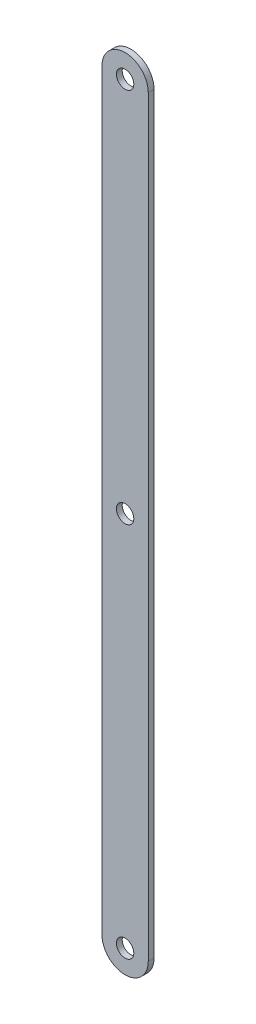
ISO-10303-21;
HEADER;
FILE_DESCRIPTION(('STEP AP214'),'2;1');
FILE_NAME('part.step','',(''),(''),'','','');
FILE_SCHEMA(('AUTOMOTIVE_DESIGN { 1 0 10303 214 1 1 1 1 }'));
ENDSEC;
DATA;
#1=APPLICATION_CONTEXT('core data for automotive mechanical design processes');
#2=APPLICATION_PROTOCOL_DEFINITION('international standard','automotive_design',2000,#1);
#3=PRODUCT_CONTEXT('',#1,'mechanical');
#4=PRODUCT('Part','Part','',(#3));
#5=PRODUCT_RELATED_PRODUCT_CATEGORY('part','',(#4));
#6=PRODUCT_DEFINITION_FORMATION('','',#4);
#7=PRODUCT_DEFINITION_CONTEXT('part definition',#1,'design');
#8=PRODUCT_DEFINITION('design','',#6,#7);
#9=PRODUCT_DEFINITION_SHAPE('','',#8);
#10=(LENGTH_UNIT() NAMED_UNIT(*) SI_UNIT(.MILLI.,.METRE.));
#11=(NAMED_UNIT(*) PLANE_ANGLE_UNIT() SI_UNIT($,.RADIAN.));
#12=(NAMED_UNIT(*) SI_UNIT($,.STERADIAN.) SOLID_ANGLE_UNIT());
#13=UNCERTAINTY_MEASURE_WITH_UNIT(LENGTH_MEASURE(1.E-05),#10,'distance_accuracy_value','');
#14=(GEOMETRIC_REPRESENTATION_CONTEXT(3) GLOBAL_UNCERTAINTY_ASSIGNED_CONTEXT((#13)) GLOBAL_UNIT_ASSIGNED_CONTEXT((#10,
#11,#12)) REPRESENTATION_CONTEXT('',''));
#15=CARTESIAN_POINT('',(0.,0.,0.));
#16=DIRECTION('',(0.,0.,1.));
#17=DIRECTION('',(1.,0.,0.));
#18=AXIS2_PLACEMENT_3D('',#15,#16,#17);
#19=CARTESIAN_POINT('',(0.,0.,5.));
#20=DIRECTION('',(0.,0.,1.));
#21=DIRECTION('',(1.,0.,0.));
#22=AXIS2_PLACEMENT_3D('',#19,#20,#21);
#23=PLANE('',#22);
#24=CARTESIAN_POINT('',(0.,0.,5.));
#25=DIRECTION('',(0.,0.,1.));
#26=DIRECTION('',(1.,0.,0.));
#27=AXIS2_PLACEMENT_3D('',#24,#25,#26);
#28=CIRCLE('',#27,7.5);
#29=CARTESIAN_POINT('',(7.5,0.,5.));
#30=VERTEX_POINT('',#29);
#31=EDGE_CURVE('E115',#30,#30,#28,.T.);
#32=ORIENTED_EDGE('',*,*,#31,.F.);
#33=EDGE_LOOP('',(#32));
#34=FACE_BOUND('',#33,.T.);
#35=CARTESIAN_POINT('',(0.,0.,5.));
#36=DIRECTION('',(0.,0.,1.));
#37=DIRECTION('',(1.,0.,0.));
#38=AXIS2_PLACEMENT_3D('',#35,#36,#37);
#39=CIRCLE('',#38,20.);
#40=CARTESIAN_POINT('',(-20.,0.,5.));
#41=VERTEX_POINT('',#40);
#42=CARTESIAN_POINT('',(20.,0.,5.));
#43=VERTEX_POINT('',#42);
#44=EDGE_CURVE('E85',#41,#43,#39,.T.);
#45=ORIENTED_EDGE('',*,*,#44,.T.);
#46=DIRECTION('',(0.,1.,0.));
#47=VECTOR('',#46,1.);
#48=CARTESIAN_POINT('',(20.,0.,5.));
#49=LINE('',#48,#47);
#50=CARTESIAN_POINT('',(20.,650.,5.));
#51=VERTEX_POINT('',#50);
#52=EDGE_CURVE('E80',#43,#51,#49,.T.);
#53=ORIENTED_EDGE('',*,*,#52,.T.);
#54=CARTESIAN_POINT('',(0.,650.,5.));
#55=DIRECTION('',(0.,0.,1.));
#56=DIRECTION('',(1.,0.,0.));
#57=AXIS2_PLACEMENT_3D('',#54,#55,#56);
#58=CIRCLE('',#57,20.);
#59=CARTESIAN_POINT('',(-20.,650.,5.));
#60=VERTEX_POINT('',#59);
#61=EDGE_CURVE('E83',#51,#60,#58,.T.);
#62=ORIENTED_EDGE('',*,*,#61,.T.);
#63=DIRECTION('',(0.,-1.,0.));
#64=VECTOR('',#63,1.);
#65=CARTESIAN_POINT('',(-20.,0.,5.));
#66=LINE('',#65,#64);
#67=EDGE_CURVE('E50',#60,#41,#66,.T.);
#68=ORIENTED_EDGE('',*,*,#67,.T.);
#69=EDGE_LOOP('',(#45,#53,#62,#68));
#70=FACE_BOUND('',#69,.T.);
#71=CARTESIAN_POINT('',(0.,650.,5.));
#72=DIRECTION('',(0.,0.,1.));
#73=DIRECTION('',(1.,0.,0.));
#74=AXIS2_PLACEMENT_3D('',#71,#72,#73);
#75=CIRCLE('',#74,7.5);
#76=CARTESIAN_POINT('',(7.5,650.,5.));
#77=VERTEX_POINT('',#76);
#78=EDGE_CURVE('E100',#77,#77,#75,.T.);
#79=ORIENTED_EDGE('',*,*,#78,.F.);
#80=EDGE_LOOP('',(#79));
#81=FACE_BOUND('',#80,.T.);
#82=CARTESIAN_POINT('',(0.,325.,5.));
#83=DIRECTION('',(0.,0.,1.));
#84=DIRECTION('',(1.,0.,0.));
#85=AXIS2_PLACEMENT_3D('',#82,#83,#84);
#86=CIRCLE('',#85,7.5);
#87=CARTESIAN_POINT('',(7.5,325.,5.));
#88=VERTEX_POINT('',#87);
#89=EDGE_CURVE('E121',#88,#88,#86,.T.);
#90=ORIENTED_EDGE('',*,*,#89,.F.);
#91=EDGE_LOOP('',(#90));
#92=FACE_BOUND('',#91,.T.);
#93=ADVANCED_FACE('F33',(#34,#70,#81,#92),#23,.T.);
#94=CARTESIAN_POINT('',(0.,0.,0.));
#95=DIRECTION('',(0.,0.,1.));
#96=DIRECTION('',(1.,0.,0.));
#97=AXIS2_PLACEMENT_3D('',#94,#95,#96);
#98=PLANE('',#97);
#99=CARTESIAN_POINT('',(0.,0.,0.));
#100=DIRECTION('',(0.,0.,1.));
#101=DIRECTION('',(1.,0.,0.));
#102=AXIS2_PLACEMENT_3D('',#99,#100,#101);
#103=CIRCLE('',#102,20.);
#104=CARTESIAN_POINT('',(-20.,0.,0.));
#105=VERTEX_POINT('',#104);
#106=CARTESIAN_POINT('',(20.,0.,0.));
#107=VERTEX_POINT('',#106);
#108=EDGE_CURVE('E97',#105,#107,#103,.T.);
#109=ORIENTED_EDGE('',*,*,#108,.F.);
#110=DIRECTION('',(0.,-1.,0.));
#111=VECTOR('',#110,1.);
#112=CARTESIAN_POINT('',(-20.,0.,0.));
#113=LINE('',#112,#111);
#114=CARTESIAN_POINT('',(-20.,650.,0.));
#115=VERTEX_POINT('',#114);
#116=EDGE_CURVE('E73',#115,#105,#113,.T.);
#117=ORIENTED_EDGE('',*,*,#116,.F.);
#118=CARTESIAN_POINT('',(0.,650.,0.));
#119=DIRECTION('',(0.,0.,1.));
#120=DIRECTION('',(1.,0.,0.));
#121=AXIS2_PLACEMENT_3D('',#118,#119,#120);
#122=CIRCLE('',#121,20.);
#123=CARTESIAN_POINT('',(20.,650.,0.));
#124=VERTEX_POINT('',#123);
#125=EDGE_CURVE('E67',#124,#115,#122,.T.);
#126=ORIENTED_EDGE('',*,*,#125,.F.);
#127=DIRECTION('',(0.,1.,0.));
#128=VECTOR('',#127,1.);
#129=CARTESIAN_POINT('',(20.,0.,0.));
#130=LINE('',#129,#128);
#131=EDGE_CURVE('E89',#107,#124,#130,.T.);
#132=ORIENTED_EDGE('',*,*,#131,.F.);
#133=EDGE_LOOP('',(#109,#117,#126,#132));
#134=FACE_BOUND('',#133,.T.);
#135=CARTESIAN_POINT('',(0.,650.,0.));
#136=DIRECTION('',(0.,0.,1.));
#137=DIRECTION('',(1.,0.,0.));
#138=AXIS2_PLACEMENT_3D('',#135,#136,#137);
#139=CIRCLE('',#138,7.5);
#140=CARTESIAN_POINT('',(7.5,650.,0.));
#141=VERTEX_POINT('',#140);
#142=EDGE_CURVE('E112',#141,#141,#139,.T.);
#143=ORIENTED_EDGE('',*,*,#142,.T.);
#144=EDGE_LOOP('',(#143));
#145=FACE_BOUND('',#144,.T.);
#146=CARTESIAN_POINT('',(0.,0.,0.));
#147=DIRECTION('',(0.,0.,1.));
#148=DIRECTION('',(1.,0.,0.));
#149=AXIS2_PLACEMENT_3D('',#146,#147,#148);
#150=CIRCLE('',#149,7.5);
#151=CARTESIAN_POINT('',(7.5,0.,0.));
#152=VERTEX_POINT('',#151);
#153=EDGE_CURVE('E118',#152,#152,#150,.T.);
#154=ORIENTED_EDGE('',*,*,#153,.T.);
#155=EDGE_LOOP('',(#154));
#156=FACE_BOUND('',#155,.T.);
#157=CARTESIAN_POINT('',(0.,325.,0.));
#158=DIRECTION('',(0.,0.,1.));
#159=DIRECTION('',(1.,0.,0.));
#160=AXIS2_PLACEMENT_3D('',#157,#158,#159);
#161=CIRCLE('',#160,7.5);
#162=CARTESIAN_POINT('',(7.5,325.,0.));
#163=VERTEX_POINT('',#162);
#164=EDGE_CURVE('E124',#163,#163,#161,.T.);
#165=ORIENTED_EDGE('',*,*,#164,.T.);
#166=EDGE_LOOP('',(#165));
#167=FACE_BOUND('',#166,.T.);
#168=ADVANCED_FACE('F108',(#134,#145,#156,#167),#98,.F.);
#169=CARTESIAN_POINT('',(0.,0.,5.));
#170=DIRECTION('',(0.,0.,-1.));
#171=DIRECTION('',(-1.,0.,0.));
#172=AXIS2_PLACEMENT_3D('',#169,#170,#171);
#173=CYLINDRICAL_SURFACE('',#172,20.);
#174=ORIENTED_EDGE('',*,*,#108,.T.);
#175=DIRECTION('',(0.,0.,-1.));
#176=VECTOR('',#175,1.);
#177=CARTESIAN_POINT('',(20.,0.,5.));
#178=LINE('',#177,#176);
#179=EDGE_CURVE('E11',#43,#107,#178,.T.);
#180=ORIENTED_EDGE('',*,*,#179,.F.);
#181=ORIENTED_EDGE('',*,*,#44,.F.);
#182=DIRECTION('',(0.,0.,-1.));
#183=VECTOR('',#182,1.);
#184=CARTESIAN_POINT('',(-20.,0.,5.));
#185=LINE('',#184,#183);
#186=EDGE_CURVE('E93',#41,#105,#185,.T.);
#187=ORIENTED_EDGE('',*,*,#186,.T.);
#188=EDGE_LOOP('',(#174,#180,#181,#187));
#189=FACE_BOUND('',#188,.T.);
#190=ADVANCED_FACE('F35',(#189),#173,.T.);
#191=CARTESIAN_POINT('',(20.,0.,5.));
#192=DIRECTION('',(-1.,0.,0.));
#193=DIRECTION('',(0.,0.,1.));
#194=AXIS2_PLACEMENT_3D('',#191,#192,#193);
#195=PLANE('',#194);
#196=ORIENTED_EDGE('',*,*,#131,.T.);
#197=DIRECTION('',(0.,0.,-1.));
#198=VECTOR('',#197,1.);
#199=CARTESIAN_POINT('',(20.,650.,5.));
#200=LINE('',#199,#198);
#201=EDGE_CURVE('E42',#51,#124,#200,.T.);
#202=ORIENTED_EDGE('',*,*,#201,.F.);
#203=ORIENTED_EDGE('',*,*,#52,.F.);
#204=ORIENTED_EDGE('',*,*,#179,.T.);
#205=EDGE_LOOP('',(#196,#202,#203,#204));
#206=FACE_BOUND('',#205,.T.);
#207=ADVANCED_FACE('F88',(#206),#195,.F.);
#208=CARTESIAN_POINT('',(0.,650.,5.));
#209=DIRECTION('',(0.,0.,-1.));
#210=DIRECTION('',(-1.,0.,0.));
#211=AXIS2_PLACEMENT_3D('',#208,#209,#210);
#212=CYLINDRICAL_SURFACE('',#211,20.);
#213=ORIENTED_EDGE('',*,*,#125,.T.);
#214=DIRECTION('',(0.,0.,-1.));
#215=VECTOR('',#214,1.);
#216=CARTESIAN_POINT('',(-20.,650.,5.));
#217=LINE('',#216,#215);
#218=EDGE_CURVE('E90',#60,#115,#217,.T.);
#219=ORIENTED_EDGE('',*,*,#218,.F.);
#220=ORIENTED_EDGE('',*,*,#61,.F.);
#221=ORIENTED_EDGE('',*,*,#201,.T.);
#222=EDGE_LOOP('',(#213,#219,#220,#221));
#223=FACE_BOUND('',#222,.T.);
#224=ADVANCED_FACE('F91',(#223),#212,.T.);
#225=CARTESIAN_POINT('',(-20.,0.,5.));
#226=DIRECTION('',(1.,0.,0.));
#227=DIRECTION('',(0.,0.,-1.));
#228=AXIS2_PLACEMENT_3D('',#225,#226,#227);
#229=PLANE('',#228);
#230=ORIENTED_EDGE('',*,*,#116,.T.);
#231=ORIENTED_EDGE('',*,*,#186,.F.);
#232=ORIENTED_EDGE('',*,*,#67,.F.);
#233=ORIENTED_EDGE('',*,*,#218,.T.);
#234=EDGE_LOOP('',(#230,#231,#232,#233));
#235=FACE_BOUND('',#234,.T.);
#236=ADVANCED_FACE('F105',(#235),#229,.F.);
#237=CARTESIAN_POINT('',(0.,650.,5.));
#238=DIRECTION('',(0.,0.,-1.));
#239=DIRECTION('',(-1.,0.,0.));
#240=AXIS2_PLACEMENT_3D('',#237,#238,#239);
#241=CYLINDRICAL_SURFACE('',#240,7.5);
#242=ORIENTED_EDGE('',*,*,#78,.T.);
#243=EDGE_LOOP('',(#242));
#244=FACE_BOUND('',#243,.T.);
#245=ORIENTED_EDGE('',*,*,#142,.F.);
#246=EDGE_LOOP('',(#245));
#247=FACE_BOUND('',#246,.T.);
#248=ADVANCED_FACE('F142',(#244,#247),#241,.F.);
#249=CARTESIAN_POINT('',(0.,0.,5.));
#250=DIRECTION('',(0.,0.,-1.));
#251=DIRECTION('',(-1.,0.,0.));
#252=AXIS2_PLACEMENT_3D('',#249,#250,#251);
#253=CYLINDRICAL_SURFACE('',#252,7.5);
#254=ORIENTED_EDGE('',*,*,#31,.T.);
#255=EDGE_LOOP('',(#254));
#256=FACE_BOUND('',#255,.T.);
#257=ORIENTED_EDGE('',*,*,#153,.F.);
#258=EDGE_LOOP('',(#257));
#259=FACE_BOUND('',#258,.T.);
#260=ADVANCED_FACE('F188',(#256,#259),#253,.F.);
#261=CARTESIAN_POINT('',(0.,325.,5.));
#262=DIRECTION('',(0.,0.,-1.));
#263=DIRECTION('',(-1.,0.,0.));
#264=AXIS2_PLACEMENT_3D('',#261,#262,#263);
#265=CYLINDRICAL_SURFACE('',#264,7.5);
#266=ORIENTED_EDGE('',*,*,#89,.T.);
#267=EDGE_LOOP('',(#266));
#268=FACE_BOUND('',#267,.T.);
#269=ORIENTED_EDGE('',*,*,#164,.F.);
#270=EDGE_LOOP('',(#269));
#271=FACE_BOUND('',#270,.T.);
#272=ADVANCED_FACE('F130',(#268,#271),#265,.F.);
#273=CLOSED_SHELL('',(#93,#168,#190,#207,#224,#236,#248,#260,#272));
#274=MANIFOLD_SOLID_BREP('B2',#273);
#275=ADVANCED_BREP_SHAPE_REPRESENTATION('',(#18,#274),#14);
#276=SHAPE_DEFINITION_REPRESENTATION(#9,#275);
ENDSEC;
END-ISO-10303-21;
